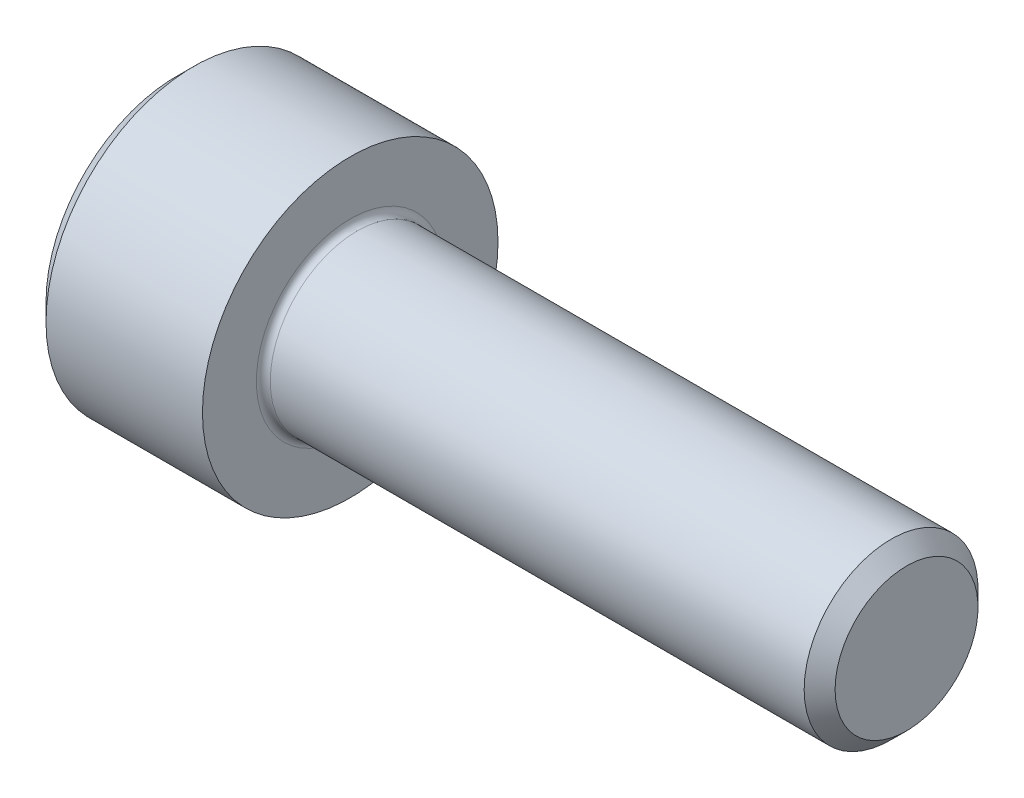
ISO-10303-21;
HEADER;
FILE_DESCRIPTION(('STEP AP214'),'2;1');
FILE_NAME('part.step','',(''),(''),'','','');
FILE_SCHEMA(('AUTOMOTIVE_DESIGN { 1 0 10303 214 1 1 1 1 }'));
ENDSEC;
DATA;
#1=APPLICATION_CONTEXT('core data for automotive mechanical design processes');
#2=APPLICATION_PROTOCOL_DEFINITION('international standard','automotive_design',2000,#1);
#3=PRODUCT_CONTEXT('',#1,'mechanical');
#4=PRODUCT('Part','Part','',(#3));
#5=PRODUCT_RELATED_PRODUCT_CATEGORY('part','',(#4));
#6=PRODUCT_DEFINITION_FORMATION('','',#4);
#7=PRODUCT_DEFINITION_CONTEXT('part definition',#1,'design');
#8=PRODUCT_DEFINITION('design','',#6,#7);
#9=PRODUCT_DEFINITION_SHAPE('','',#8);
#10=(LENGTH_UNIT() NAMED_UNIT(*) SI_UNIT(.MILLI.,.METRE.));
#11=(NAMED_UNIT(*) PLANE_ANGLE_UNIT() SI_UNIT($,.RADIAN.));
#12=(NAMED_UNIT(*) SI_UNIT($,.STERADIAN.) SOLID_ANGLE_UNIT());
#13=UNCERTAINTY_MEASURE_WITH_UNIT(LENGTH_MEASURE(1.E-05),#10,'distance_accuracy_value','');
#14=(GEOMETRIC_REPRESENTATION_CONTEXT(3) GLOBAL_UNCERTAINTY_ASSIGNED_CONTEXT((#13)) GLOBAL_UNIT_ASSIGNED_CONTEXT((#10,
#11,#12)) REPRESENTATION_CONTEXT('',''));
#15=CARTESIAN_POINT('',(0.,0.,0.));
#16=DIRECTION('',(0.,0.,1.));
#17=DIRECTION('',(1.,0.,0.));
#18=AXIS2_PLACEMENT_3D('',#15,#16,#17);
#19=CARTESIAN_POINT('',(0.,0.,0.));
#20=DIRECTION('',(-1.,0.,0.));
#21=DIRECTION('',(0.,0.,1.));
#22=AXIS2_PLACEMENT_3D('',#19,#20,#21);
#23=PLANE('',#22);
#24=CARTESIAN_POINT('',(0.,0.,0.));
#25=DIRECTION('',(-1.,0.,0.));
#26=DIRECTION('',(0.,0.,1.));
#27=AXIS2_PLACEMENT_3D('',#24,#25,#26);
#28=CIRCLE('',#27,3.75);
#29=CARTESIAN_POINT('',(0.,0.,3.75));
#30=VERTEX_POINT('',#29);
#31=EDGE_CURVE('E44',#30,#30,#28,.T.);
#32=ORIENTED_EDGE('',*,*,#31,.T.);
#33=EDGE_LOOP('',(#32));
#34=FACE_BOUND('',#33,.T.);
#35=ADVANCED_FACE('F33',(#34),#23,.T.);
#36=CARTESIAN_POINT('',(0.,0.,0.));
#37=DIRECTION('',(1.,0.,0.));
#38=DIRECTION('',(0.,0.,-1.));
#39=AXIS2_PLACEMENT_3D('',#36,#37,#38);
#40=CONICAL_SURFACE('',#39,3.75,0.78539816339745);
#41=CARTESIAN_POINT('',(0.5,0.,0.));
#42=DIRECTION('',(-1.,0.,0.));
#43=DIRECTION('',(0.,0.,1.));
#44=AXIS2_PLACEMENT_3D('',#41,#42,#43);
#45=CIRCLE('',#44,4.25);
#46=CARTESIAN_POINT('',(0.5,0.,4.25));
#47=VERTEX_POINT('',#46);
#48=EDGE_CURVE('E48',#47,#47,#45,.T.);
#49=ORIENTED_EDGE('',*,*,#48,.T.);
#50=EDGE_LOOP('',(#49));
#51=FACE_BOUND('',#50,.T.);
#52=ORIENTED_EDGE('',*,*,#31,.F.);
#53=EDGE_LOOP('',(#52));
#54=FACE_BOUND('',#53,.T.);
#55=ADVANCED_FACE('F77',(#51,#54),#40,.T.);
#56=CARTESIAN_POINT('',(-31.75,0.,0.));
#57=DIRECTION('',(-1.,0.,0.));
#58=DIRECTION('',(0.,0.,1.));
#59=AXIS2_PLACEMENT_3D('',#56,#57,#58);
#60=CYLINDRICAL_SURFACE('',#59,4.25);
#61=CARTESIAN_POINT('',(5.,0.,0.));
#62=DIRECTION('',(-1.,0.,0.));
#63=DIRECTION('',(0.,0.,1.));
#64=AXIS2_PLACEMENT_3D('',#61,#62,#63);
#65=CIRCLE('',#64,4.25);
#66=CARTESIAN_POINT('',(5.,0.,4.25));
#67=VERTEX_POINT('',#66);
#68=EDGE_CURVE('E53',#67,#67,#65,.T.);
#69=ORIENTED_EDGE('',*,*,#68,.T.);
#70=EDGE_LOOP('',(#69));
#71=FACE_BOUND('',#70,.T.);
#72=ORIENTED_EDGE('',*,*,#48,.F.);
#73=EDGE_LOOP('',(#72));
#74=FACE_BOUND('',#73,.T.);
#75=ADVANCED_FACE('F82',(#71,#74),#60,.T.);
#76=CARTESIAN_POINT('',(5.,4.25,0.));
#77=DIRECTION('',(1.,0.,0.));
#78=DIRECTION('',(0.,0.,-1.));
#79=AXIS2_PLACEMENT_3D('',#76,#77,#78);
#80=PLANE('',#79);
#81=CARTESIAN_POINT('',(5.,0.,0.));
#82=DIRECTION('',(1.,0.,0.));
#83=DIRECTION('',(0.,0.,-1.));
#84=AXIS2_PLACEMENT_3D('',#81,#82,#83);
#85=CIRCLE('',#84,2.69999999999999);
#86=CARTESIAN_POINT('',(5.,0.,-2.69999999999999));
#87=VERTEX_POINT('',#86);
#88=EDGE_CURVE('E40',#87,#87,#85,.F.);
#89=ORIENTED_EDGE('',*,*,#88,.T.);
#90=EDGE_LOOP('',(#89));
#91=FACE_BOUND('',#90,.T.);
#92=ORIENTED_EDGE('',*,*,#68,.F.);
#93=EDGE_LOOP('',(#92));
#94=FACE_BOUND('',#93,.T.);
#95=ADVANCED_FACE('F88',(#91,#94),#80,.T.);
#96=CARTESIAN_POINT('',(-31.75,0.,0.));
#97=DIRECTION('',(-1.,0.,0.));
#98=DIRECTION('',(0.,0.,1.));
#99=AXIS2_PLACEMENT_3D('',#96,#97,#98);
#100=CYLINDRICAL_SURFACE('',#99,2.49999999999999);
#101=CARTESIAN_POINT('',(5.2,0.,0.));
#102=DIRECTION('',(1.,0.,0.));
#103=DIRECTION('',(0.,0.,-1.));
#104=AXIS2_PLACEMENT_3D('',#101,#102,#103);
#105=CIRCLE('',#104,2.49999999999999);
#106=CARTESIAN_POINT('',(5.2,0.,-2.49999999999999));
#107=VERTEX_POINT('',#106);
#108=EDGE_CURVE('E10',#107,#107,#105,.T.);
#109=ORIENTED_EDGE('',*,*,#108,.T.);
#110=EDGE_LOOP('',(#109));
#111=FACE_BOUND('',#110,.T.);
#112=CARTESIAN_POINT('',(20.555,0.,0.));
#113=DIRECTION('',(-1.,0.,0.));
#114=DIRECTION('',(0.,0.,1.));
#115=AXIS2_PLACEMENT_3D('',#112,#113,#114);
#116=CIRCLE('',#115,2.49999999999998);
#117=CARTESIAN_POINT('',(20.555,0.,2.49999999999998));
#118=VERTEX_POINT('',#117);
#119=EDGE_CURVE('E56',#118,#118,#116,.T.);
#120=ORIENTED_EDGE('',*,*,#119,.T.);
#121=EDGE_LOOP('',(#120));
#122=FACE_BOUND('',#121,.T.);
#123=ADVANCED_FACE('F73',(#111,#122),#100,.T.);
#124=CARTESIAN_POINT('',(21.,0.,0.));
#125=DIRECTION('',(-1.,0.,0.));
#126=DIRECTION('',(0.,0.,1.));
#127=AXIS2_PLACEMENT_3D('',#124,#125,#126);
#128=CONICAL_SURFACE('',#127,2.055,0.785398163397403);
#129=ORIENTED_EDGE('',*,*,#119,.F.);
#130=EDGE_LOOP('',(#129));
#131=FACE_BOUND('',#130,.T.);
#132=CARTESIAN_POINT('',(21.,0.,0.));
#133=DIRECTION('',(-1.,0.,0.));
#134=DIRECTION('',(0.,0.,1.));
#135=AXIS2_PLACEMENT_3D('',#132,#133,#134);
#136=CIRCLE('',#135,2.055);
#137=CARTESIAN_POINT('',(21.,0.,2.055));
#138=VERTEX_POINT('',#137);
#139=EDGE_CURVE('E59',#138,#138,#136,.T.);
#140=ORIENTED_EDGE('',*,*,#139,.T.);
#141=EDGE_LOOP('',(#140));
#142=FACE_BOUND('',#141,.T.);
#143=ADVANCED_FACE('F63',(#131,#142),#128,.T.);
#144=CARTESIAN_POINT('',(21.,2.055,0.));
#145=DIRECTION('',(1.,0.,0.));
#146=DIRECTION('',(0.,0.,-1.));
#147=AXIS2_PLACEMENT_3D('',#144,#145,#146);
#148=PLANE('',#147);
#149=ORIENTED_EDGE('',*,*,#139,.F.);
#150=EDGE_LOOP('',(#149));
#151=FACE_BOUND('',#150,.T.);
#152=ADVANCED_FACE('F65',(#151),#148,.T.);
#153=CARTESIAN_POINT('',(5.2,0.,0.));
#154=DIRECTION('',(1.,0.,0.));
#155=DIRECTION('',(0.,0.,-1.));
#156=AXIS2_PLACEMENT_3D('',#153,#154,#155);
#157=TOROIDAL_SURFACE('',#156,2.69999999999999,0.2);
#158=ORIENTED_EDGE('',*,*,#108,.F.);
#159=EDGE_LOOP('',(#158));
#160=FACE_BOUND('',#159,.T.);
#161=ORIENTED_EDGE('',*,*,#88,.F.);
#162=EDGE_LOOP('',(#161));
#163=FACE_BOUND('',#162,.T.);
#164=ADVANCED_FACE('F35',(#160,#163),#157,.F.);
#165=CLOSED_SHELL('',(#35,#55,#75,#95,#123,#143,#152,#164));
#166=MANIFOLD_SOLID_BREP('B2',#165);
#167=ADVANCED_BREP_SHAPE_REPRESENTATION('',(#18,#166),#14);
#168=SHAPE_DEFINITION_REPRESENTATION(#9,#167);
ENDSEC;
END-ISO-10303-21;
